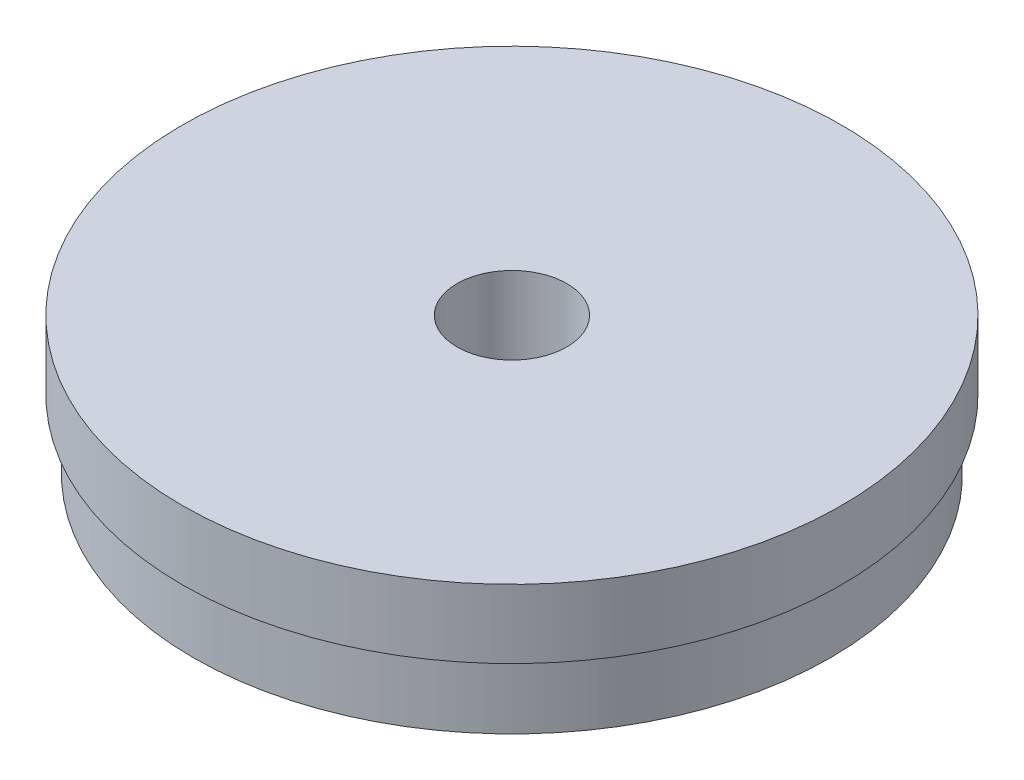
ISO-10303-21;
HEADER;
FILE_DESCRIPTION(('STEP AP214'),'2;1');
FILE_NAME('part.step','',(''),(''),'','','');
FILE_SCHEMA(('AUTOMOTIVE_DESIGN { 1 0 10303 214 1 1 1 1 }'));
ENDSEC;
DATA;
#1=APPLICATION_CONTEXT('core data for automotive mechanical design processes');
#2=APPLICATION_PROTOCOL_DEFINITION('international standard','automotive_design',2000,#1);
#3=PRODUCT_CONTEXT('',#1,'mechanical');
#4=PRODUCT('Part','Part','',(#3));
#5=PRODUCT_RELATED_PRODUCT_CATEGORY('part','',(#4));
#6=PRODUCT_DEFINITION_FORMATION('','',#4);
#7=PRODUCT_DEFINITION_CONTEXT('part definition',#1,'design');
#8=PRODUCT_DEFINITION('design','',#6,#7);
#9=PRODUCT_DEFINITION_SHAPE('','',#8);
#10=(LENGTH_UNIT() NAMED_UNIT(*) SI_UNIT(.MILLI.,.METRE.));
#11=(NAMED_UNIT(*) PLANE_ANGLE_UNIT() SI_UNIT($,.RADIAN.));
#12=(NAMED_UNIT(*) SI_UNIT($,.STERADIAN.) SOLID_ANGLE_UNIT());
#13=UNCERTAINTY_MEASURE_WITH_UNIT(LENGTH_MEASURE(1.E-05),#10,'distance_accuracy_value','');
#14=(GEOMETRIC_REPRESENTATION_CONTEXT(3) GLOBAL_UNCERTAINTY_ASSIGNED_CONTEXT((#13)) GLOBAL_UNIT_ASSIGNED_CONTEXT((#10,
#11,#12)) REPRESENTATION_CONTEXT('',''));
#15=CARTESIAN_POINT('',(0.,0.,0.));
#16=DIRECTION('',(0.,0.,1.));
#17=DIRECTION('',(1.,0.,0.));
#18=AXIS2_PLACEMENT_3D('',#15,#16,#17);
#19=CARTESIAN_POINT('',(0.,48.0535714285714,0.));
#20=DIRECTION('',(0.,-1.,0.));
#21=DIRECTION('',(0.,0.,-1.));
#22=AXIS2_PLACEMENT_3D('',#19,#20,#21);
#23=PLANE('',#22);
#24=CARTESIAN_POINT('',(0.,48.0535714285714,0.));
#25=DIRECTION('',(0.,1.,0.));
#26=DIRECTION('',(0.,0.,1.));
#27=AXIS2_PLACEMENT_3D('',#24,#25,#26);
#28=CIRCLE('',#27,20.);
#29=CARTESIAN_POINT('',(0.,48.0535714285714,20.));
#30=VERTEX_POINT('',#29);
#31=EDGE_CURVE('E61',#30,#30,#28,.T.);
#32=ORIENTED_EDGE('',*,*,#31,.F.);
#33=EDGE_LOOP('',(#32));
#34=FACE_BOUND('',#33,.T.);
#35=CARTESIAN_POINT('',(0.,48.0535714285714,0.));
#36=DIRECTION('',(0.,1.,0.));
#37=DIRECTION('',(0.,0.,1.));
#38=AXIS2_PLACEMENT_3D('',#35,#36,#37);
#39=CIRCLE('',#38,120.);
#40=CARTESIAN_POINT('',(0.,48.0535714285714,120.));
#41=VERTEX_POINT('',#40);
#42=EDGE_CURVE('E10',#41,#41,#39,.T.);
#43=ORIENTED_EDGE('',*,*,#42,.T.);
#44=EDGE_LOOP('',(#43));
#45=FACE_BOUND('',#44,.T.);
#46=ADVANCED_FACE('F37',(#34,#45),#23,.F.);
#47=CARTESIAN_POINT('',(0.,53.1607142857143,0.));
#48=DIRECTION('',(0.,1.,0.));
#49=DIRECTION('',(0.,0.,1.));
#50=AXIS2_PLACEMENT_3D('',#47,#48,#49);
#51=CYLINDRICAL_SURFACE('',#50,120.);
#52=ORIENTED_EDGE('',*,*,#42,.F.);
#53=EDGE_LOOP('',(#52));
#54=FACE_BOUND('',#53,.T.);
#55=CARTESIAN_POINT('',(0.,23.0535714285714,0.));
#56=DIRECTION('',(0.,1.,0.));
#57=DIRECTION('',(0.,0.,1.));
#58=AXIS2_PLACEMENT_3D('',#55,#56,#57);
#59=CIRCLE('',#58,120.);
#60=CARTESIAN_POINT('',(0.,23.0535714285714,120.));
#61=VERTEX_POINT('',#60);
#62=EDGE_CURVE('E44',#61,#61,#59,.T.);
#63=ORIENTED_EDGE('',*,*,#62,.T.);
#64=EDGE_LOOP('',(#63));
#65=FACE_BOUND('',#64,.T.);
#66=ADVANCED_FACE('F79',(#54,#65),#51,.T.);
#67=CARTESIAN_POINT('',(120.,23.0535714285714,0.));
#68=DIRECTION('',(0.,1.,0.));
#69=DIRECTION('',(0.,0.,1.));
#70=AXIS2_PLACEMENT_3D('',#67,#68,#69);
#71=PLANE('',#70);
#72=ORIENTED_EDGE('',*,*,#62,.F.);
#73=EDGE_LOOP('',(#72));
#74=FACE_BOUND('',#73,.T.);
#75=CARTESIAN_POINT('',(0.,23.0535714285714,0.));
#76=DIRECTION('',(0.,1.,0.));
#77=DIRECTION('',(0.,0.,1.));
#78=AXIS2_PLACEMENT_3D('',#75,#76,#77);
#79=CIRCLE('',#78,116.);
#80=CARTESIAN_POINT('',(0.,23.0535714285714,116.));
#81=VERTEX_POINT('',#80);
#82=EDGE_CURVE('E49',#81,#81,#79,.T.);
#83=ORIENTED_EDGE('',*,*,#82,.T.);
#84=EDGE_LOOP('',(#83));
#85=FACE_BOUND('',#84,.T.);
#86=ADVANCED_FACE('F83',(#74,#85),#71,.F.);
#87=CARTESIAN_POINT('',(0.,53.1607142857143,0.));
#88=DIRECTION('',(0.,1.,0.));
#89=DIRECTION('',(0.,0.,1.));
#90=AXIS2_PLACEMENT_3D('',#87,#88,#89);
#91=CYLINDRICAL_SURFACE('',#90,116.);
#92=ORIENTED_EDGE('',*,*,#82,.F.);
#93=EDGE_LOOP('',(#92));
#94=FACE_BOUND('',#93,.T.);
#95=CARTESIAN_POINT('',(0.,-1.94642857142858,0.));
#96=DIRECTION('',(0.,1.,0.));
#97=DIRECTION('',(0.,0.,1.));
#98=AXIS2_PLACEMENT_3D('',#95,#96,#97);
#99=CIRCLE('',#98,116.);
#100=CARTESIAN_POINT('',(0.,-1.94642857142858,116.));
#101=VERTEX_POINT('',#100);
#102=EDGE_CURVE('E54',#101,#101,#99,.T.);
#103=ORIENTED_EDGE('',*,*,#102,.T.);
#104=EDGE_LOOP('',(#103));
#105=FACE_BOUND('',#104,.T.);
#106=ADVANCED_FACE('F88',(#94,#105),#91,.T.);
#107=CARTESIAN_POINT('',(116.,-1.94642857142858,0.));
#108=DIRECTION('',(0.,1.,0.));
#109=DIRECTION('',(0.,0.,1.));
#110=AXIS2_PLACEMENT_3D('',#107,#108,#109);
#111=PLANE('',#110);
#112=CARTESIAN_POINT('',(0.,-1.94642857142858,0.));
#113=DIRECTION('',(0.,1.,0.));
#114=DIRECTION('',(0.,0.,1.));
#115=AXIS2_PLACEMENT_3D('',#112,#113,#114);
#116=CIRCLE('',#115,20.);
#117=CARTESIAN_POINT('',(0.,-1.94642857142858,20.));
#118=VERTEX_POINT('',#117);
#119=EDGE_CURVE('E60',#118,#118,#116,.T.);
#120=ORIENTED_EDGE('',*,*,#119,.T.);
#121=EDGE_LOOP('',(#120));
#122=FACE_BOUND('',#121,.T.);
#123=ORIENTED_EDGE('',*,*,#102,.F.);
#124=EDGE_LOOP('',(#123));
#125=FACE_BOUND('',#124,.T.);
#126=ADVANCED_FACE('F69',(#122,#125),#111,.F.);
#127=CARTESIAN_POINT('',(0.,-1.94642857142858,0.));
#128=DIRECTION('',(0.,1.,0.));
#129=DIRECTION('',(0.,0.,1.));
#130=AXIS2_PLACEMENT_3D('',#127,#128,#129);
#131=CYLINDRICAL_SURFACE('',#130,20.);
#132=ORIENTED_EDGE('',*,*,#119,.F.);
#133=EDGE_LOOP('',(#132));
#134=FACE_BOUND('',#133,.T.);
#135=ORIENTED_EDGE('',*,*,#31,.T.);
#136=EDGE_LOOP('',(#135));
#137=FACE_BOUND('',#136,.T.);
#138=ADVANCED_FACE('F72',(#134,#137),#131,.F.);
#139=CLOSED_SHELL('',(#46,#66,#86,#106,#126,#138));
#140=MANIFOLD_SOLID_BREP('B2',#139);
#141=ADVANCED_BREP_SHAPE_REPRESENTATION('',(#18,#140),#14);
#142=SHAPE_DEFINITION_REPRESENTATION(#9,#141);
ENDSEC;
END-ISO-10303-21;
